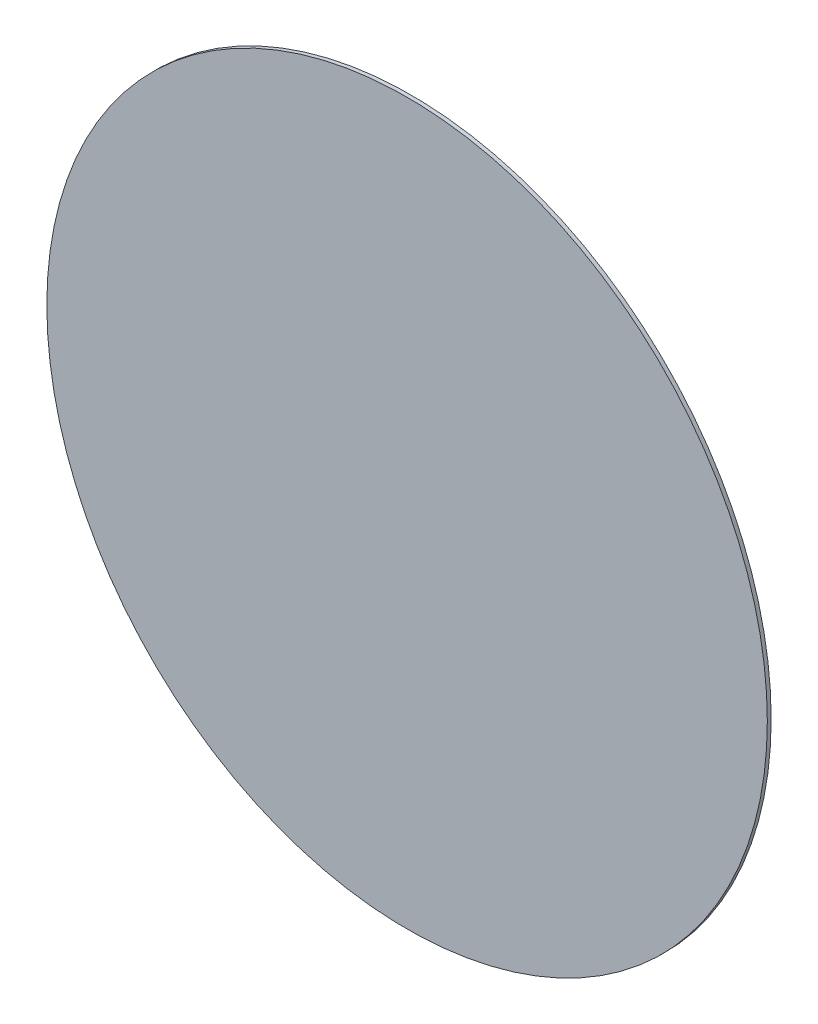
ISO-10303-21;
HEADER;
FILE_DESCRIPTION(('STEP AP214'),'2;1');
FILE_NAME('part.step','',(''),(''),'','','');
FILE_SCHEMA(('AUTOMOTIVE_DESIGN { 1 0 10303 214 1 1 1 1 }'));
ENDSEC;
DATA;
#1=APPLICATION_CONTEXT('core data for automotive mechanical design processes');
#2=APPLICATION_PROTOCOL_DEFINITION('international standard','automotive_design',2000,#1);
#3=PRODUCT_CONTEXT('',#1,'mechanical');
#4=PRODUCT('Part','Part','',(#3));
#5=PRODUCT_RELATED_PRODUCT_CATEGORY('part','',(#4));
#6=PRODUCT_DEFINITION_FORMATION('','',#4);
#7=PRODUCT_DEFINITION_CONTEXT('part definition',#1,'design');
#8=PRODUCT_DEFINITION('design','',#6,#7);
#9=PRODUCT_DEFINITION_SHAPE('','',#8);
#10=(LENGTH_UNIT() NAMED_UNIT(*) SI_UNIT(.MILLI.,.METRE.));
#11=(NAMED_UNIT(*) PLANE_ANGLE_UNIT() SI_UNIT($,.RADIAN.));
#12=(NAMED_UNIT(*) SI_UNIT($,.STERADIAN.) SOLID_ANGLE_UNIT());
#13=UNCERTAINTY_MEASURE_WITH_UNIT(LENGTH_MEASURE(1.E-05),#10,'distance_accuracy_value','');
#14=(GEOMETRIC_REPRESENTATION_CONTEXT(3) GLOBAL_UNCERTAINTY_ASSIGNED_CONTEXT((#13)) GLOBAL_UNIT_ASSIGNED_CONTEXT((#10,
#11,#12)) REPRESENTATION_CONTEXT('',''));
#15=CARTESIAN_POINT('',(0.,0.,0.));
#16=DIRECTION('',(0.,0.,1.));
#17=DIRECTION('',(1.,0.,0.));
#18=AXIS2_PLACEMENT_3D('',#15,#16,#17);
#19=CARTESIAN_POINT('',(0.,0.,1.6));
#20=DIRECTION('',(0.,0.,-1.));
#21=DIRECTION('',(-1.,0.,0.));
#22=AXIS2_PLACEMENT_3D('',#19,#20,#21);
#23=CYLINDRICAL_SURFACE('',#22,150.);
#24=CARTESIAN_POINT('',(0.,0.,1.6));
#25=DIRECTION('',(0.,0.,1.));
#26=DIRECTION('',(1.,0.,0.));
#27=AXIS2_PLACEMENT_3D('',#24,#25,#26);
#28=CIRCLE('',#27,150.);
#29=CARTESIAN_POINT('',(150.,0.,1.6));
#30=VERTEX_POINT('',#29);
#31=EDGE_CURVE('E10',#30,#30,#28,.T.);
#32=ORIENTED_EDGE('',*,*,#31,.F.);
#33=EDGE_LOOP('',(#32));
#34=FACE_BOUND('',#33,.T.);
#35=CARTESIAN_POINT('',(0.,0.,0.));
#36=DIRECTION('',(0.,0.,1.));
#37=DIRECTION('',(1.,0.,0.));
#38=AXIS2_PLACEMENT_3D('',#35,#36,#37);
#39=CIRCLE('',#38,150.);
#40=CARTESIAN_POINT('',(150.,0.,0.));
#41=VERTEX_POINT('',#40);
#42=EDGE_CURVE('E44',#41,#41,#39,.T.);
#43=ORIENTED_EDGE('',*,*,#42,.T.);
#44=EDGE_LOOP('',(#43));
#45=FACE_BOUND('',#44,.T.);
#46=ADVANCED_FACE('F41',(#34,#45),#23,.T.);
#47=CARTESIAN_POINT('',(0.,0.,1.6));
#48=DIRECTION('',(0.,0.,1.));
#49=DIRECTION('',(1.,0.,0.));
#50=AXIS2_PLACEMENT_3D('',#47,#48,#49);
#51=PLANE('',#50);
#52=ORIENTED_EDGE('',*,*,#31,.T.);
#53=EDGE_LOOP('',(#52));
#54=FACE_BOUND('',#53,.T.);
#55=ADVANCED_FACE('F58',(#54),#51,.T.);
#56=CARTESIAN_POINT('',(0.,0.,0.));
#57=DIRECTION('',(0.,0.,1.));
#58=DIRECTION('',(1.,0.,0.));
#59=AXIS2_PLACEMENT_3D('',#56,#57,#58);
#60=PLANE('',#59);
#61=ORIENTED_EDGE('',*,*,#42,.F.);
#62=EDGE_LOOP('',(#61));
#63=FACE_BOUND('',#62,.T.);
#64=ADVANCED_FACE('F56',(#63),#60,.F.);
#65=CLOSED_SHELL('',(#46,#55,#64));
#66=MANIFOLD_SOLID_BREP('B2',#65);
#67=ADVANCED_BREP_SHAPE_REPRESENTATION('',(#18,#66),#14);
#68=SHAPE_DEFINITION_REPRESENTATION(#9,#67);
ENDSEC;
END-ISO-10303-21;
